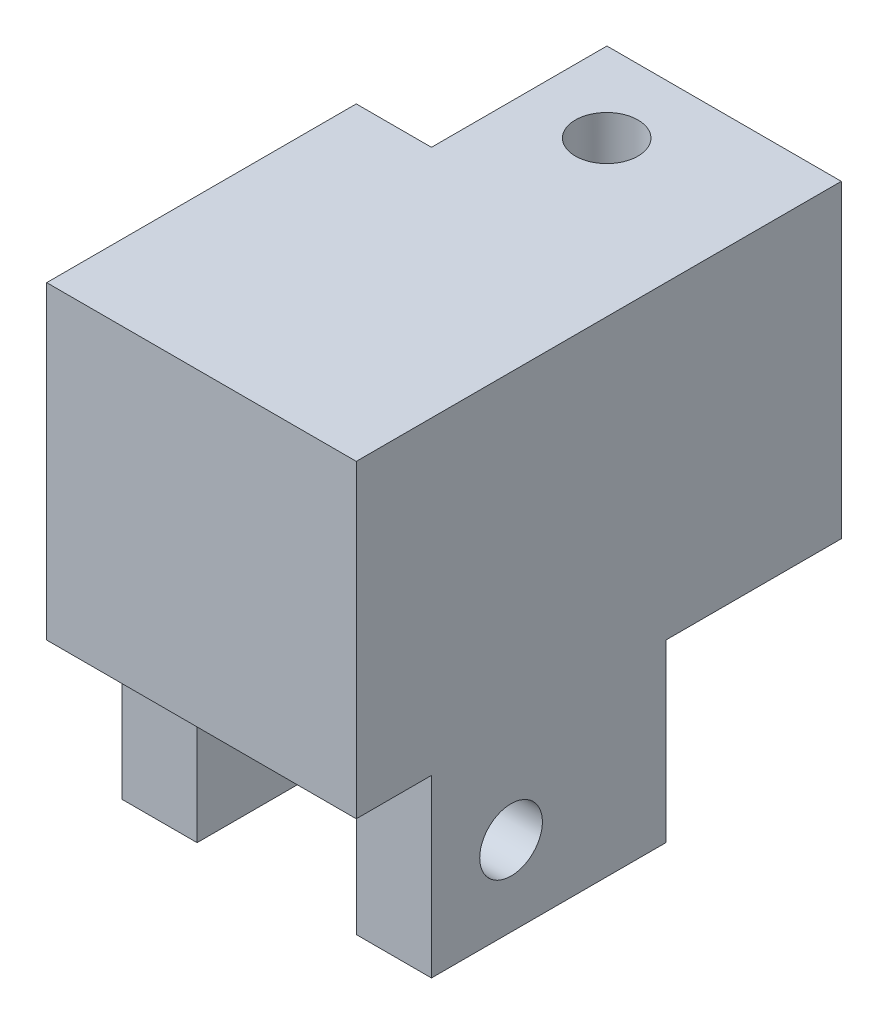
ISO-10303-21;
HEADER;
FILE_DESCRIPTION(('STEP AP214'),'2;1');
FILE_NAME('part.step','',(''),(''),'','','');
FILE_SCHEMA(('AUTOMOTIVE_DESIGN { 1 0 10303 214 1 1 1 1 }'));
ENDSEC;
DATA;
#1=APPLICATION_CONTEXT('core data for automotive mechanical design processes');
#2=APPLICATION_PROTOCOL_DEFINITION('international standard','automotive_design',2000,#1);
#3=PRODUCT_CONTEXT('',#1,'mechanical');
#4=PRODUCT('Part','Part','',(#3));
#5=PRODUCT_RELATED_PRODUCT_CATEGORY('part','',(#4));
#6=PRODUCT_DEFINITION_FORMATION('','',#4);
#7=PRODUCT_DEFINITION_CONTEXT('part definition',#1,'design');
#8=PRODUCT_DEFINITION('design','',#6,#7);
#9=PRODUCT_DEFINITION_SHAPE('','',#8);
#10=(LENGTH_UNIT() NAMED_UNIT(*) SI_UNIT(.MILLI.,.METRE.));
#11=(NAMED_UNIT(*) PLANE_ANGLE_UNIT() SI_UNIT($,.RADIAN.));
#12=(NAMED_UNIT(*) SI_UNIT($,.STERADIAN.) SOLID_ANGLE_UNIT());
#13=UNCERTAINTY_MEASURE_WITH_UNIT(LENGTH_MEASURE(1.E-05),#10,'distance_accuracy_value','');
#14=(GEOMETRIC_REPRESENTATION_CONTEXT(3) GLOBAL_UNCERTAINTY_ASSIGNED_CONTEXT((#13)) GLOBAL_UNIT_ASSIGNED_CONTEXT((#10,
#11,#12)) REPRESENTATION_CONTEXT('',''));
#15=CARTESIAN_POINT('',(0.,0.,0.));
#16=DIRECTION('',(0.,0.,1.));
#17=DIRECTION('',(1.,0.,0.));
#18=AXIS2_PLACEMENT_3D('',#15,#16,#17);
#19=CARTESIAN_POINT('',(0.,24.7,-12.35));
#20=DIRECTION('',(0.,0.,1.));
#21=DIRECTION('',(1.,0.,0.));
#22=AXIS2_PLACEMENT_3D('',#19,#20,#21);
#23=PLANE('',#22);
#24=DIRECTION('',(-1.,0.,0.));
#25=VECTOR('',#24,1.);
#26=CARTESIAN_POINT('',(0.,0.,-12.35));
#27=LINE('',#26,#25);
#28=CARTESIAN_POINT('',(12.35,0.,-12.35));
#29=VERTEX_POINT('',#28);
#30=CARTESIAN_POINT('',(-6.35,0.,-12.35));
#31=VERTEX_POINT('',#30);
#32=EDGE_CURVE('E186',#29,#31,#27,.T.);
#33=ORIENTED_EDGE('',*,*,#32,.F.);
#34=DIRECTION('',(0.,-1.,0.));
#35=VECTOR('',#34,1.);
#36=CARTESIAN_POINT('',(12.35,24.7,-12.35));
#37=LINE('',#36,#35);
#38=CARTESIAN_POINT('',(12.35,-14.,-12.35));
#39=VERTEX_POINT('',#38);
#40=EDGE_CURVE('E293',#29,#39,#37,.T.);
#41=ORIENTED_EDGE('',*,*,#40,.T.);
#42=DIRECTION('',(1.,0.,0.));
#43=VECTOR('',#42,1.);
#44=CARTESIAN_POINT('',(0.,-14.,-12.35));
#45=LINE('',#44,#43);
#46=CARTESIAN_POINT('',(-12.35,-14.,-12.35));
#47=VERTEX_POINT('',#46);
#48=EDGE_CURVE('E225',#47,#39,#45,.T.);
#49=ORIENTED_EDGE('',*,*,#48,.F.);
#50=DIRECTION('',(0.,-1.,0.));
#51=VECTOR('',#50,1.);
#52=CARTESIAN_POINT('',(-12.35,24.7,-12.35));
#53=LINE('',#52,#51);
#54=CARTESIAN_POINT('',(-12.35,24.7,-12.35));
#55=VERTEX_POINT('',#54);
#56=EDGE_CURVE('E281',#55,#47,#53,.T.);
#57=ORIENTED_EDGE('',*,*,#56,.F.);
#58=DIRECTION('',(-1.,0.,0.));
#59=VECTOR('',#58,1.);
#60=CARTESIAN_POINT('',(0.,24.7,-12.35));
#61=LINE('',#60,#59);
#62=CARTESIAN_POINT('',(-6.35,24.7,-12.35));
#63=VERTEX_POINT('',#62);
#64=EDGE_CURVE('E278',#63,#55,#61,.T.);
#65=ORIENTED_EDGE('',*,*,#64,.F.);
#66=DIRECTION('',(0.,1.,0.));
#67=VECTOR('',#66,1.);
#68=CARTESIAN_POINT('',(-6.35,0.,-12.35));
#69=LINE('',#68,#67);
#70=CARTESIAN_POINT('',(-6.35,18.7,-12.35));
#71=VERTEX_POINT('',#70);
#72=EDGE_CURVE('E58',#71,#63,#69,.T.);
#73=ORIENTED_EDGE('',*,*,#72,.F.);
#74=DIRECTION('',(-1.,0.,0.));
#75=VECTOR('',#74,1.);
#76=CARTESIAN_POINT('',(0.,18.7,-12.35));
#77=LINE('',#76,#75);
#78=CARTESIAN_POINT('',(6.35,18.7,-12.35));
#79=VERTEX_POINT('',#78);
#80=EDGE_CURVE('E62',#79,#71,#77,.T.);
#81=ORIENTED_EDGE('',*,*,#80,.F.);
#82=DIRECTION('',(0.,1.,0.));
#83=VECTOR('',#82,1.);
#84=CARTESIAN_POINT('',(6.35,0.,-12.35));
#85=LINE('',#84,#83);
#86=CARTESIAN_POINT('',(6.35,6.,-12.35));
#87=VERTEX_POINT('',#86);
#88=EDGE_CURVE('E345',#87,#79,#85,.T.);
#89=ORIENTED_EDGE('',*,*,#88,.F.);
#90=DIRECTION('',(-1.,0.,0.));
#91=VECTOR('',#90,1.);
#92=CARTESIAN_POINT('',(0.,6.,-12.35));
#93=LINE('',#92,#91);
#94=CARTESIAN_POINT('',(-6.35,6.,-12.35));
#95=VERTEX_POINT('',#94);
#96=EDGE_CURVE('E342',#87,#95,#93,.T.);
#97=ORIENTED_EDGE('',*,*,#96,.T.);
#98=DIRECTION('',(0.,1.,0.));
#99=VECTOR('',#98,1.);
#100=CARTESIAN_POINT('',(-6.35,0.,-12.35));
#101=LINE('',#100,#99);
#102=EDGE_CURVE('E339',#31,#95,#101,.T.);
#103=ORIENTED_EDGE('',*,*,#102,.F.);
#104=EDGE_LOOP('',(#33,#41,#49,#57,#65,#73,#81,#89,#97,#103));
#105=FACE_BOUND('',#104,.T.);
#106=ADVANCED_FACE('F40',(#105),#23,.F.);
#107=CARTESIAN_POINT('',(0.,0.,0.));
#108=DIRECTION('',(0.,1.,0.));
#109=DIRECTION('',(0.,0.,1.));
#110=AXIS2_PLACEMENT_3D('',#107,#108,#109);
#111=PLANE('',#110);
#112=DIRECTION('',(-1.,0.,0.));
#113=VECTOR('',#112,1.);
#114=CARTESIAN_POINT('',(0.,0.,6.35));
#115=LINE('',#114,#113);
#116=CARTESIAN_POINT('',(-6.35,0.,6.35));
#117=VERTEX_POINT('',#116);
#118=CARTESIAN_POINT('',(-12.35,0.,6.35));
#119=VERTEX_POINT('',#118);
#120=EDGE_CURVE('E204',#117,#119,#115,.T.);
#121=ORIENTED_EDGE('',*,*,#120,.F.);
#122=DIRECTION('',(0.,0.,1.));
#123=VECTOR('',#122,1.);
#124=CARTESIAN_POINT('',(-6.35,0.,0.));
#125=LINE('',#124,#123);
#126=CARTESIAN_POINT('',(-6.35,0.,-6.35));
#127=VERTEX_POINT('',#126);
#128=EDGE_CURVE('E235',#127,#117,#125,.T.);
#129=ORIENTED_EDGE('',*,*,#128,.F.);
#130=DIRECTION('',(1.,0.,0.));
#131=VECTOR('',#130,1.);
#132=CARTESIAN_POINT('',(0.,0.,-6.35));
#133=LINE('',#132,#131);
#134=CARTESIAN_POINT('',(6.35,0.,-6.35));
#135=VERTEX_POINT('',#134);
#136=EDGE_CURVE('E232',#127,#135,#133,.T.);
#137=ORIENTED_EDGE('',*,*,#136,.T.);
#138=DIRECTION('',(0.,0.,1.));
#139=VECTOR('',#138,1.);
#140=CARTESIAN_POINT('',(6.35,0.,0.));
#141=LINE('',#140,#139);
#142=CARTESIAN_POINT('',(6.35,0.,6.35));
#143=VERTEX_POINT('',#142);
#144=EDGE_CURVE('E193',#135,#143,#141,.T.);
#145=ORIENTED_EDGE('',*,*,#144,.T.);
#146=DIRECTION('',(-1.,0.,0.));
#147=VECTOR('',#146,1.);
#148=CARTESIAN_POINT('',(0.,0.,6.35));
#149=LINE('',#148,#147);
#150=CARTESIAN_POINT('',(12.35,0.,6.35));
#151=VERTEX_POINT('',#150);
#152=EDGE_CURVE('E188',#151,#143,#149,.T.);
#153=ORIENTED_EDGE('',*,*,#152,.F.);
#154=DIRECTION('',(0.,0.,-1.));
#155=VECTOR('',#154,1.);
#156=CARTESIAN_POINT('',(12.35,0.,0.));
#157=LINE('',#156,#155);
#158=CARTESIAN_POINT('',(12.35,0.,12.35));
#159=VERTEX_POINT('',#158);
#160=EDGE_CURVE('E271',#159,#151,#157,.T.);
#161=ORIENTED_EDGE('',*,*,#160,.F.);
#162=DIRECTION('',(-1.,0.,0.));
#163=VECTOR('',#162,1.);
#164=CARTESIAN_POINT('',(0.,0.,12.35));
#165=LINE('',#164,#163);
#166=CARTESIAN_POINT('',(-12.35,0.,12.35));
#167=VERTEX_POINT('',#166);
#168=EDGE_CURVE('E284',#159,#167,#165,.T.);
#169=ORIENTED_EDGE('',*,*,#168,.T.);
#170=DIRECTION('',(0.,0.,-1.));
#171=VECTOR('',#170,1.);
#172=CARTESIAN_POINT('',(-12.35,0.,0.));
#173=LINE('',#172,#171);
#174=EDGE_CURVE('E265',#167,#119,#173,.T.);
#175=ORIENTED_EDGE('',*,*,#174,.T.);
#176=EDGE_LOOP('',(#121,#129,#137,#145,#153,#161,#169,#175));
#177=FACE_BOUND('',#176,.T.);
#178=ADVANCED_FACE('F417',(#177),#111,.F.);
#179=CARTESIAN_POINT('',(-12.35,24.7,0.));
#180=DIRECTION('',(-1.,0.,0.));
#181=DIRECTION('',(0.,0.,1.));
#182=AXIS2_PLACEMENT_3D('',#179,#180,#181);
#183=PLANE('',#182);
#184=CARTESIAN_POINT('',(-12.35,-7.63,0.));
#185=DIRECTION('',(-1.,0.,0.));
#186=DIRECTION('',(0.,0.,1.));
#187=AXIS2_PLACEMENT_3D('',#184,#185,#186);
#188=CIRCLE('',#187,2.5);
#189=CARTESIAN_POINT('',(-12.35,-7.63,2.5));
#190=VERTEX_POINT('',#189);
#191=EDGE_CURVE('E439',#190,#190,#188,.T.);
#192=ORIENTED_EDGE('',*,*,#191,.F.);
#193=EDGE_LOOP('',(#192));
#194=FACE_BOUND('',#193,.T.);
#195=ORIENTED_EDGE('',*,*,#174,.F.);
#196=DIRECTION('',(0.,-1.,0.));
#197=VECTOR('',#196,1.);
#198=CARTESIAN_POINT('',(-12.35,24.7,12.35));
#199=LINE('',#198,#197);
#200=CARTESIAN_POINT('',(-12.35,24.7,12.35));
#201=VERTEX_POINT('',#200);
#202=EDGE_CURVE('E11',#201,#167,#199,.T.);
#203=ORIENTED_EDGE('',*,*,#202,.F.);
#204=DIRECTION('',(0.,0.,-1.));
#205=VECTOR('',#204,1.);
#206=CARTESIAN_POINT('',(-12.35,24.7,0.));
#207=LINE('',#206,#205);
#208=EDGE_CURVE('E266',#201,#55,#207,.T.);
#209=ORIENTED_EDGE('',*,*,#208,.T.);
#210=ORIENTED_EDGE('',*,*,#56,.T.);
#211=DIRECTION('',(0.,0.,-1.));
#212=VECTOR('',#211,1.);
#213=CARTESIAN_POINT('',(-12.35,-14.,0.));
#214=LINE('',#213,#212);
#215=CARTESIAN_POINT('',(-12.35,-14.,6.35));
#216=VERTEX_POINT('',#215);
#217=EDGE_CURVE('E221',#216,#47,#214,.T.);
#218=ORIENTED_EDGE('',*,*,#217,.F.);
#219=DIRECTION('',(0.,1.,0.));
#220=VECTOR('',#219,1.);
#221=CARTESIAN_POINT('',(-12.35,-14.,6.35));
#222=LINE('',#221,#220);
#223=EDGE_CURVE('E228',#216,#119,#222,.T.);
#224=ORIENTED_EDGE('',*,*,#223,.T.);
#225=EDGE_LOOP('',(#195,#203,#209,#210,#218,#224));
#226=FACE_BOUND('',#225,.T.);
#227=ADVANCED_FACE('F42',(#194,#226),#183,.T.);
#228=CARTESIAN_POINT('',(0.,24.7,12.35));
#229=DIRECTION('',(0.,0.,1.));
#230=DIRECTION('',(1.,0.,0.));
#231=AXIS2_PLACEMENT_3D('',#228,#229,#230);
#232=PLANE('',#231);
#233=ORIENTED_EDGE('',*,*,#168,.F.);
#234=DIRECTION('',(0.,-1.,0.));
#235=VECTOR('',#234,1.);
#236=CARTESIAN_POINT('',(12.35,24.7,12.35));
#237=LINE('',#236,#235);
#238=CARTESIAN_POINT('',(12.35,24.7,12.35));
#239=VERTEX_POINT('',#238);
#240=EDGE_CURVE('E50',#239,#159,#237,.T.);
#241=ORIENTED_EDGE('',*,*,#240,.F.);
#242=DIRECTION('',(-1.,0.,0.));
#243=VECTOR('',#242,1.);
#244=CARTESIAN_POINT('',(0.,24.7,12.35));
#245=LINE('',#244,#243);
#246=EDGE_CURVE('E270',#239,#201,#245,.T.);
#247=ORIENTED_EDGE('',*,*,#246,.T.);
#248=ORIENTED_EDGE('',*,*,#202,.T.);
#249=EDGE_LOOP('',(#233,#241,#247,#248));
#250=FACE_BOUND('',#249,.T.);
#251=ADVANCED_FACE('F394',(#250),#232,.T.);
#252=CARTESIAN_POINT('',(12.35,24.7,0.));
#253=DIRECTION('',(-1.,0.,0.));
#254=DIRECTION('',(0.,0.,1.));
#255=AXIS2_PLACEMENT_3D('',#252,#253,#254);
#256=PLANE('',#255);
#257=CARTESIAN_POINT('',(12.35,-7.63,0.));
#258=DIRECTION('',(-1.,0.,0.));
#259=DIRECTION('',(0.,0.,1.));
#260=AXIS2_PLACEMENT_3D('',#257,#258,#259);
#261=CIRCLE('',#260,2.5);
#262=CARTESIAN_POINT('',(12.35,-7.63,2.5));
#263=VERTEX_POINT('',#262);
#264=EDGE_CURVE('E442',#263,#263,#261,.T.);
#265=ORIENTED_EDGE('',*,*,#264,.T.);
#266=EDGE_LOOP('',(#265));
#267=FACE_BOUND('',#266,.T.);
#268=ORIENTED_EDGE('',*,*,#160,.T.);
#269=DIRECTION('',(0.,1.,0.));
#270=VECTOR('',#269,1.);
#271=CARTESIAN_POINT('',(12.35,-14.,6.35));
#272=LINE('',#271,#270);
#273=CARTESIAN_POINT('',(12.35,-14.,6.35));
#274=VERTEX_POINT('',#273);
#275=EDGE_CURVE('E261',#274,#151,#272,.T.);
#276=ORIENTED_EDGE('',*,*,#275,.F.);
#277=DIRECTION('',(0.,0.,1.));
#278=VECTOR('',#277,1.);
#279=CARTESIAN_POINT('',(12.35,-14.,0.));
#280=LINE('',#279,#278);
#281=EDGE_CURVE('E199',#39,#274,#280,.T.);
#282=ORIENTED_EDGE('',*,*,#281,.F.);
#283=ORIENTED_EDGE('',*,*,#40,.F.);
#284=DIRECTION('',(0.,0.,1.));
#285=VECTOR('',#284,1.);
#286=CARTESIAN_POINT('',(12.35,0.,-26.35));
#287=LINE('',#286,#285);
#288=CARTESIAN_POINT('',(12.35,0.,-26.35));
#289=VERTEX_POINT('',#288);
#290=EDGE_CURVE('E336',#289,#29,#287,.T.);
#291=ORIENTED_EDGE('',*,*,#290,.F.);
#292=DIRECTION('',(0.,-1.,0.));
#293=VECTOR('',#292,1.);
#294=CARTESIAN_POINT('',(12.35,0.,-26.35));
#295=LINE('',#294,#293);
#296=CARTESIAN_POINT('',(12.35,24.7,-26.35));
#297=VERTEX_POINT('',#296);
#298=EDGE_CURVE('E179',#297,#289,#295,.T.);
#299=ORIENTED_EDGE('',*,*,#298,.F.);
#300=DIRECTION('',(0.,0.,-1.));
#301=VECTOR('',#300,1.);
#302=CARTESIAN_POINT('',(12.35,24.7,0.));
#303=LINE('',#302,#301);
#304=EDGE_CURVE('E275',#239,#297,#303,.T.);
#305=ORIENTED_EDGE('',*,*,#304,.F.);
#306=ORIENTED_EDGE('',*,*,#240,.T.);
#307=EDGE_LOOP('',(#268,#276,#282,#283,#291,#299,#305,#306));
#308=FACE_BOUND('',#307,.T.);
#309=ADVANCED_FACE('F378',(#267,#308),#256,.F.);
#310=CARTESIAN_POINT('',(0.,24.7,0.));
#311=DIRECTION('',(0.,1.,0.));
#312=DIRECTION('',(0.,0.,1.));
#313=AXIS2_PLACEMENT_3D('',#310,#311,#312);
#314=PLANE('',#313);
#315=CARTESIAN_POINT('',(0.,24.7,-19.98));
#316=DIRECTION('',(0.,-1.,0.));
#317=DIRECTION('',(0.,0.,-1.));
#318=AXIS2_PLACEMENT_3D('',#315,#316,#317);
#319=CIRCLE('',#318,2.5);
#320=CARTESIAN_POINT('',(0.,24.7,-22.48));
#321=VERTEX_POINT('',#320);
#322=EDGE_CURVE('E301',#321,#321,#319,.T.);
#323=ORIENTED_EDGE('',*,*,#322,.T.);
#324=EDGE_LOOP('',(#323));
#325=FACE_BOUND('',#324,.T.);
#326=ORIENTED_EDGE('',*,*,#208,.F.);
#327=ORIENTED_EDGE('',*,*,#246,.F.);
#328=ORIENTED_EDGE('',*,*,#304,.T.);
#329=DIRECTION('',(1.,0.,0.));
#330=VECTOR('',#329,1.);
#331=CARTESIAN_POINT('',(0.,24.7,-26.35));
#332=LINE('',#331,#330);
#333=CARTESIAN_POINT('',(-6.35,24.7,-26.35));
#334=VERTEX_POINT('',#333);
#335=EDGE_CURVE('E331',#334,#297,#332,.T.);
#336=ORIENTED_EDGE('',*,*,#335,.F.);
#337=DIRECTION('',(0.,0.,1.));
#338=VECTOR('',#337,1.);
#339=CARTESIAN_POINT('',(-6.35,24.7,-26.35));
#340=LINE('',#339,#338);
#341=EDGE_CURVE('E354',#334,#63,#340,.T.);
#342=ORIENTED_EDGE('',*,*,#341,.T.);
#343=ORIENTED_EDGE('',*,*,#64,.T.);
#344=EDGE_LOOP('',(#326,#327,#328,#336,#342,#343));
#345=FACE_BOUND('',#344,.T.);
#346=ADVANCED_FACE('F391',(#325,#345),#314,.T.);
#347=CARTESIAN_POINT('',(0.,-14.,6.35));
#348=DIRECTION('',(0.,0.,-1.));
#349=DIRECTION('',(-1.,0.,0.));
#350=AXIS2_PLACEMENT_3D('',#347,#348,#349);
#351=PLANE('',#350);
#352=ORIENTED_EDGE('',*,*,#152,.T.);
#353=DIRECTION('',(0.,1.,0.));
#354=VECTOR('',#353,1.);
#355=CARTESIAN_POINT('',(6.35,-14.,6.35));
#356=LINE('',#355,#354);
#357=CARTESIAN_POINT('',(6.35,-14.,6.35));
#358=VERTEX_POINT('',#357);
#359=EDGE_CURVE('E257',#358,#143,#356,.T.);
#360=ORIENTED_EDGE('',*,*,#359,.F.);
#361=DIRECTION('',(-1.,0.,0.));
#362=VECTOR('',#361,1.);
#363=CARTESIAN_POINT('',(0.,-14.,6.35));
#364=LINE('',#363,#362);
#365=EDGE_CURVE('E203',#274,#358,#364,.T.);
#366=ORIENTED_EDGE('',*,*,#365,.F.);
#367=ORIENTED_EDGE('',*,*,#275,.T.);
#368=EDGE_LOOP('',(#352,#360,#366,#367));
#369=FACE_BOUND('',#368,.T.);
#370=ADVANCED_FACE('F462',(#369),#351,.F.);
#371=CARTESIAN_POINT('',(6.35,-14.,0.));
#372=DIRECTION('',(-1.,0.,0.));
#373=DIRECTION('',(0.,0.,1.));
#374=AXIS2_PLACEMENT_3D('',#371,#372,#373);
#375=PLANE('',#374);
#376=CARTESIAN_POINT('',(6.35,-7.63,0.));
#377=DIRECTION('',(-1.,0.,0.));
#378=DIRECTION('',(0.,0.,1.));
#379=AXIS2_PLACEMENT_3D('',#376,#377,#378);
#380=CIRCLE('',#379,2.5);
#381=CARTESIAN_POINT('',(6.35,-7.63,2.5));
#382=VERTEX_POINT('',#381);
#383=EDGE_CURVE('E315',#382,#382,#380,.T.);
#384=ORIENTED_EDGE('',*,*,#383,.F.);
#385=EDGE_LOOP('',(#384));
#386=FACE_BOUND('',#385,.T.);
#387=ORIENTED_EDGE('',*,*,#144,.F.);
#388=DIRECTION('',(0.,1.,0.));
#389=VECTOR('',#388,1.);
#390=CARTESIAN_POINT('',(6.35,-14.,-6.35));
#391=LINE('',#390,#389);
#392=CARTESIAN_POINT('',(6.35,-14.,-6.35));
#393=VERTEX_POINT('',#392);
#394=EDGE_CURVE('E253',#393,#135,#391,.T.);
#395=ORIENTED_EDGE('',*,*,#394,.F.);
#396=DIRECTION('',(0.,0.,1.));
#397=VECTOR('',#396,1.);
#398=CARTESIAN_POINT('',(6.35,-14.,0.));
#399=LINE('',#398,#397);
#400=EDGE_CURVE('E207',#393,#358,#399,.T.);
#401=ORIENTED_EDGE('',*,*,#400,.T.);
#402=ORIENTED_EDGE('',*,*,#359,.T.);
#403=EDGE_LOOP('',(#387,#395,#401,#402));
#404=FACE_BOUND('',#403,.T.);
#405=ADVANCED_FACE('F458',(#386,#404),#375,.T.);
#406=CARTESIAN_POINT('',(0.,-14.,-6.35));
#407=DIRECTION('',(0.,0.,1.));
#408=DIRECTION('',(1.,0.,0.));
#409=AXIS2_PLACEMENT_3D('',#406,#407,#408);
#410=PLANE('',#409);
#411=ORIENTED_EDGE('',*,*,#136,.F.);
#412=DIRECTION('',(0.,1.,0.));
#413=VECTOR('',#412,1.);
#414=CARTESIAN_POINT('',(-6.35,-14.,-6.35));
#415=LINE('',#414,#413);
#416=CARTESIAN_POINT('',(-6.35,-14.,-6.35));
#417=VERTEX_POINT('',#416);
#418=EDGE_CURVE('E249',#417,#127,#415,.T.);
#419=ORIENTED_EDGE('',*,*,#418,.F.);
#420=DIRECTION('',(1.,0.,0.));
#421=VECTOR('',#420,1.);
#422=CARTESIAN_POINT('',(0.,-14.,-6.35));
#423=LINE('',#422,#421);
#424=EDGE_CURVE('E211',#417,#393,#423,.T.);
#425=ORIENTED_EDGE('',*,*,#424,.T.);
#426=ORIENTED_EDGE('',*,*,#394,.T.);
#427=EDGE_LOOP('',(#411,#419,#425,#426));
#428=FACE_BOUND('',#427,.T.);
#429=ADVANCED_FACE('F461',(#428),#410,.T.);
#430=CARTESIAN_POINT('',(-6.35,-14.,0.));
#431=DIRECTION('',(-1.,0.,0.));
#432=DIRECTION('',(0.,0.,1.));
#433=AXIS2_PLACEMENT_3D('',#430,#431,#432);
#434=PLANE('',#433);
#435=CARTESIAN_POINT('',(-6.35,-7.63,0.));
#436=DIRECTION('',(-1.,0.,0.));
#437=DIRECTION('',(0.,0.,1.));
#438=AXIS2_PLACEMENT_3D('',#435,#436,#437);
#439=CIRCLE('',#438,2.5);
#440=CARTESIAN_POINT('',(-6.35,-7.63,2.5));
#441=VERTEX_POINT('',#440);
#442=EDGE_CURVE('E44',#441,#441,#439,.T.);
#443=ORIENTED_EDGE('',*,*,#442,.T.);
#444=EDGE_LOOP('',(#443));
#445=FACE_BOUND('',#444,.T.);
#446=ORIENTED_EDGE('',*,*,#128,.T.);
#447=DIRECTION('',(0.,1.,0.));
#448=VECTOR('',#447,1.);
#449=CARTESIAN_POINT('',(-6.35,-14.,6.35));
#450=LINE('',#449,#448);
#451=CARTESIAN_POINT('',(-6.35,-14.,6.35));
#452=VERTEX_POINT('',#451);
#453=EDGE_CURVE('E245',#452,#117,#450,.T.);
#454=ORIENTED_EDGE('',*,*,#453,.F.);
#455=DIRECTION('',(0.,0.,1.));
#456=VECTOR('',#455,1.);
#457=CARTESIAN_POINT('',(-6.35,-14.,0.));
#458=LINE('',#457,#456);
#459=EDGE_CURVE('E215',#417,#452,#458,.T.);
#460=ORIENTED_EDGE('',*,*,#459,.F.);
#461=ORIENTED_EDGE('',*,*,#418,.T.);
#462=EDGE_LOOP('',(#446,#454,#460,#461));
#463=FACE_BOUND('',#462,.T.);
#464=ADVANCED_FACE('F473',(#445,#463),#434,.F.);
#465=CARTESIAN_POINT('',(0.,-14.,6.35));
#466=DIRECTION('',(0.,0.,-1.));
#467=DIRECTION('',(-1.,0.,0.));
#468=AXIS2_PLACEMENT_3D('',#465,#466,#467);
#469=PLANE('',#468);
#470=ORIENTED_EDGE('',*,*,#120,.T.);
#471=ORIENTED_EDGE('',*,*,#223,.F.);
#472=DIRECTION('',(-1.,0.,0.));
#473=VECTOR('',#472,1.);
#474=CARTESIAN_POINT('',(0.,-14.,6.35));
#475=LINE('',#474,#473);
#476=EDGE_CURVE('E218',#452,#216,#475,.T.);
#477=ORIENTED_EDGE('',*,*,#476,.F.);
#478=ORIENTED_EDGE('',*,*,#453,.T.);
#479=EDGE_LOOP('',(#470,#471,#477,#478));
#480=FACE_BOUND('',#479,.T.);
#481=ADVANCED_FACE('F475',(#480),#469,.F.);
#482=CARTESIAN_POINT('',(0.,-14.,0.));
#483=DIRECTION('',(0.,-1.,0.));
#484=DIRECTION('',(0.,0.,-1.));
#485=AXIS2_PLACEMENT_3D('',#482,#483,#484);
#486=PLANE('',#485);
#487=ORIENTED_EDGE('',*,*,#281,.T.);
#488=ORIENTED_EDGE('',*,*,#365,.T.);
#489=ORIENTED_EDGE('',*,*,#400,.F.);
#490=ORIENTED_EDGE('',*,*,#424,.F.);
#491=ORIENTED_EDGE('',*,*,#459,.T.);
#492=ORIENTED_EDGE('',*,*,#476,.T.);
#493=ORIENTED_EDGE('',*,*,#217,.T.);
#494=ORIENTED_EDGE('',*,*,#48,.T.);
#495=EDGE_LOOP('',(#487,#488,#489,#490,#491,#492,#493,#494));
#496=FACE_BOUND('',#495,.T.);
#497=ADVANCED_FACE('F381',(#496),#486,.T.);
#498=CARTESIAN_POINT('',(0.,0.,-26.35));
#499=DIRECTION('',(0.,1.,0.));
#500=DIRECTION('',(0.,0.,1.));
#501=AXIS2_PLACEMENT_3D('',#498,#499,#500);
#502=PLANE('',#501);
#503=CARTESIAN_POINT('',(0.,0.,-19.98));
#504=DIRECTION('',(0.,-1.,0.));
#505=DIRECTION('',(0.,0.,-1.));
#506=AXIS2_PLACEMENT_3D('',#503,#504,#505);
#507=CIRCLE('',#506,2.5);
#508=CARTESIAN_POINT('',(0.,0.,-22.48));
#509=VERTEX_POINT('',#508);
#510=EDGE_CURVE('E309',#509,#509,#507,.T.);
#511=ORIENTED_EDGE('',*,*,#510,.F.);
#512=EDGE_LOOP('',(#511));
#513=FACE_BOUND('',#512,.T.);
#514=ORIENTED_EDGE('',*,*,#32,.T.);
#515=DIRECTION('',(0.,0.,1.));
#516=VECTOR('',#515,1.);
#517=CARTESIAN_POINT('',(-6.35,0.,-26.35));
#518=LINE('',#517,#516);
#519=CARTESIAN_POINT('',(-6.35,0.,-26.35));
#520=VERTEX_POINT('',#519);
#521=EDGE_CURVE('E164',#520,#31,#518,.T.);
#522=ORIENTED_EDGE('',*,*,#521,.F.);
#523=DIRECTION('',(-1.,0.,0.));
#524=VECTOR('',#523,1.);
#525=CARTESIAN_POINT('',(0.,0.,-26.35));
#526=LINE('',#525,#524);
#527=EDGE_CURVE('E173',#289,#520,#526,.T.);
#528=ORIENTED_EDGE('',*,*,#527,.F.);
#529=ORIENTED_EDGE('',*,*,#290,.T.);
#530=EDGE_LOOP('',(#514,#522,#528,#529));
#531=FACE_BOUND('',#530,.T.);
#532=ADVANCED_FACE('F185',(#513,#531),#502,.F.);
#533=CARTESIAN_POINT('',(-6.35,0.,-26.35));
#534=DIRECTION('',(1.,0.,0.));
#535=DIRECTION('',(0.,1.,0.));
#536=AXIS2_PLACEMENT_3D('',#533,#534,#535);
#537=PLANE('',#536);
#538=ORIENTED_EDGE('',*,*,#102,.T.);
#539=DIRECTION('',(0.,0.,1.));
#540=VECTOR('',#539,1.);
#541=CARTESIAN_POINT('',(-6.35,6.,-26.35));
#542=LINE('',#541,#540);
#543=CARTESIAN_POINT('',(-6.35,6.,-26.35));
#544=VERTEX_POINT('',#543);
#545=EDGE_CURVE('E167',#544,#95,#542,.T.);
#546=ORIENTED_EDGE('',*,*,#545,.F.);
#547=DIRECTION('',(0.,1.,0.));
#548=VECTOR('',#547,1.);
#549=CARTESIAN_POINT('',(-6.35,0.,-26.35));
#550=LINE('',#549,#548);
#551=EDGE_CURVE('E159',#520,#544,#550,.T.);
#552=ORIENTED_EDGE('',*,*,#551,.F.);
#553=ORIENTED_EDGE('',*,*,#521,.T.);
#554=EDGE_LOOP('',(#538,#546,#552,#553));
#555=FACE_BOUND('',#554,.T.);
#556=ADVANCED_FACE('F162',(#555),#537,.F.);
#557=CARTESIAN_POINT('',(0.,6.,-26.35));
#558=DIRECTION('',(0.,1.,0.));
#559=DIRECTION('',(0.,0.,1.));
#560=AXIS2_PLACEMENT_3D('',#557,#558,#559);
#561=PLANE('',#560);
#562=CARTESIAN_POINT('',(0.,6.,-19.98));
#563=DIRECTION('',(0.,1.,0.));
#564=DIRECTION('',(0.,0.,1.));
#565=AXIS2_PLACEMENT_3D('',#562,#563,#564);
#566=CIRCLE('',#565,2.5);
#567=CARTESIAN_POINT('',(0.,6.,-17.48));
#568=VERTEX_POINT('',#567);
#569=EDGE_CURVE('E300',#568,#568,#566,.T.);
#570=ORIENTED_EDGE('',*,*,#569,.F.);
#571=EDGE_LOOP('',(#570));
#572=FACE_BOUND('',#571,.T.);
#573=ORIENTED_EDGE('',*,*,#96,.F.);
#574=DIRECTION('',(0.,0.,1.));
#575=VECTOR('',#574,1.);
#576=CARTESIAN_POINT('',(6.35,6.,-26.35));
#577=LINE('',#576,#575);
#578=CARTESIAN_POINT('',(6.35,6.,-26.35));
#579=VERTEX_POINT('',#578);
#580=EDGE_CURVE('E195',#579,#87,#577,.T.);
#581=ORIENTED_EDGE('',*,*,#580,.F.);
#582=DIRECTION('',(-1.,0.,0.));
#583=VECTOR('',#582,1.);
#584=CARTESIAN_POINT('',(0.,6.,-26.35));
#585=LINE('',#584,#583);
#586=EDGE_CURVE('E172',#579,#544,#585,.T.);
#587=ORIENTED_EDGE('',*,*,#586,.T.);
#588=ORIENTED_EDGE('',*,*,#545,.T.);
#589=EDGE_LOOP('',(#573,#581,#587,#588));
#590=FACE_BOUND('',#589,.T.);
#591=ADVANCED_FACE('F373',(#572,#590),#561,.T.);
#592=CARTESIAN_POINT('',(6.35,0.,-26.35));
#593=DIRECTION('',(1.,0.,0.));
#594=DIRECTION('',(0.,0.,-1.));
#595=AXIS2_PLACEMENT_3D('',#592,#593,#594);
#596=PLANE('',#595);
#597=ORIENTED_EDGE('',*,*,#88,.T.);
#598=DIRECTION('',(0.,0.,1.));
#599=VECTOR('',#598,1.);
#600=CARTESIAN_POINT('',(6.35,18.7,-26.35));
#601=LINE('',#600,#599);
#602=CARTESIAN_POINT('',(6.35,18.7,-26.35));
#603=VERTEX_POINT('',#602);
#604=EDGE_CURVE('E362',#603,#79,#601,.T.);
#605=ORIENTED_EDGE('',*,*,#604,.F.);
#606=DIRECTION('',(0.,1.,0.));
#607=VECTOR('',#606,1.);
#608=CARTESIAN_POINT('',(6.35,0.,-26.35));
#609=LINE('',#608,#607);
#610=EDGE_CURVE('E322',#579,#603,#609,.T.);
#611=ORIENTED_EDGE('',*,*,#610,.F.);
#612=ORIENTED_EDGE('',*,*,#580,.T.);
#613=EDGE_LOOP('',(#597,#605,#611,#612));
#614=FACE_BOUND('',#613,.T.);
#615=ADVANCED_FACE('F370',(#614),#596,.F.);
#616=CARTESIAN_POINT('',(0.,18.7,-26.35));
#617=DIRECTION('',(0.,1.,0.));
#618=DIRECTION('',(0.,0.,1.));
#619=AXIS2_PLACEMENT_3D('',#616,#617,#618);
#620=PLANE('',#619);
#621=CARTESIAN_POINT('',(0.,18.7,-19.98));
#622=DIRECTION('',(0.,1.,0.));
#623=DIRECTION('',(0.,0.,1.));
#624=AXIS2_PLACEMENT_3D('',#621,#622,#623);
#625=CIRCLE('',#624,2.5);
#626=CARTESIAN_POINT('',(0.,18.7,-17.48));
#627=VERTEX_POINT('',#626);
#628=EDGE_CURVE('E297',#627,#627,#625,.T.);
#629=ORIENTED_EDGE('',*,*,#628,.T.);
#630=EDGE_LOOP('',(#629));
#631=FACE_BOUND('',#630,.T.);
#632=ORIENTED_EDGE('',*,*,#80,.T.);
#633=DIRECTION('',(0.,0.,1.));
#634=VECTOR('',#633,1.);
#635=CARTESIAN_POINT('',(-6.35,18.7,-26.35));
#636=LINE('',#635,#634);
#637=CARTESIAN_POINT('',(-6.35,18.7,-26.35));
#638=VERTEX_POINT('',#637);
#639=EDGE_CURVE('E358',#638,#71,#636,.T.);
#640=ORIENTED_EDGE('',*,*,#639,.F.);
#641=DIRECTION('',(-1.,0.,0.));
#642=VECTOR('',#641,1.);
#643=CARTESIAN_POINT('',(0.,18.7,-26.35));
#644=LINE('',#643,#642);
#645=EDGE_CURVE('E325',#603,#638,#644,.T.);
#646=ORIENTED_EDGE('',*,*,#645,.F.);
#647=ORIENTED_EDGE('',*,*,#604,.T.);
#648=EDGE_LOOP('',(#632,#640,#646,#647));
#649=FACE_BOUND('',#648,.T.);
#650=ADVANCED_FACE('F405',(#631,#649),#620,.F.);
#651=CARTESIAN_POINT('',(-6.35,0.,-26.35));
#652=DIRECTION('',(1.,0.,0.));
#653=DIRECTION('',(0.,1.,0.));
#654=AXIS2_PLACEMENT_3D('',#651,#652,#653);
#655=PLANE('',#654);
#656=ORIENTED_EDGE('',*,*,#72,.T.);
#657=ORIENTED_EDGE('',*,*,#341,.F.);
#658=DIRECTION('',(0.,1.,0.));
#659=VECTOR('',#658,1.);
#660=CARTESIAN_POINT('',(-6.35,0.,-26.35));
#661=LINE('',#660,#659);
#662=EDGE_CURVE('E328',#638,#334,#661,.T.);
#663=ORIENTED_EDGE('',*,*,#662,.F.);
#664=ORIENTED_EDGE('',*,*,#639,.T.);
#665=EDGE_LOOP('',(#656,#657,#663,#664));
#666=FACE_BOUND('',#665,.T.);
#667=ADVANCED_FACE('F403',(#666),#655,.F.);
#668=CARTESIAN_POINT('',(0.,0.,-26.35));
#669=DIRECTION('',(0.,0.,-1.));
#670=DIRECTION('',(-1.,0.,0.));
#671=AXIS2_PLACEMENT_3D('',#668,#669,#670);
#672=PLANE('',#671);
#673=ORIENTED_EDGE('',*,*,#527,.T.);
#674=ORIENTED_EDGE('',*,*,#551,.T.);
#675=ORIENTED_EDGE('',*,*,#586,.F.);
#676=ORIENTED_EDGE('',*,*,#610,.T.);
#677=ORIENTED_EDGE('',*,*,#645,.T.);
#678=ORIENTED_EDGE('',*,*,#662,.T.);
#679=ORIENTED_EDGE('',*,*,#335,.T.);
#680=ORIENTED_EDGE('',*,*,#298,.T.);
#681=EDGE_LOOP('',(#673,#674,#675,#676,#677,#678,#679,#680));
#682=FACE_BOUND('',#681,.T.);
#683=ADVANCED_FACE('F176',(#682),#672,.T.);
#684=CARTESIAN_POINT('',(0.,24.7,-19.98));
#685=DIRECTION('',(0.,-1.,0.));
#686=DIRECTION('',(0.,0.,-1.));
#687=AXIS2_PLACEMENT_3D('',#684,#685,#686);
#688=CYLINDRICAL_SURFACE('',#687,2.5);
#689=ORIENTED_EDGE('',*,*,#322,.F.);
#690=EDGE_LOOP('',(#689));
#691=FACE_BOUND('',#690,.T.);
#692=ORIENTED_EDGE('',*,*,#628,.F.);
#693=EDGE_LOOP('',(#692));
#694=FACE_BOUND('',#693,.T.);
#695=ADVANCED_FACE('F507',(#691,#694),#688,.F.);
#696=ORIENTED_EDGE('',*,*,#569,.T.);
#697=EDGE_LOOP('',(#696));
#698=FACE_BOUND('',#697,.T.);
#699=ORIENTED_EDGE('',*,*,#510,.T.);
#700=EDGE_LOOP('',(#699));
#701=FACE_BOUND('',#700,.T.);
#702=ADVANCED_FACE('F503',(#698,#701),#688,.F.);
#703=CARTESIAN_POINT('',(12.35,-7.63,0.));
#704=DIRECTION('',(-1.,0.,0.));
#705=DIRECTION('',(0.,0.,1.));
#706=AXIS2_PLACEMENT_3D('',#703,#704,#705);
#707=CYLINDRICAL_SURFACE('',#706,2.5);
#708=ORIENTED_EDGE('',*,*,#191,.T.);
#709=EDGE_LOOP('',(#708));
#710=FACE_BOUND('',#709,.T.);
#711=ORIENTED_EDGE('',*,*,#442,.F.);
#712=EDGE_LOOP('',(#711));
#713=FACE_BOUND('',#712,.T.);
#714=ADVANCED_FACE('F506',(#710,#713),#707,.F.);
#715=ORIENTED_EDGE('',*,*,#383,.T.);
#716=EDGE_LOOP('',(#715));
#717=FACE_BOUND('',#716,.T.);
#718=ORIENTED_EDGE('',*,*,#264,.F.);
#719=EDGE_LOOP('',(#718));
#720=FACE_BOUND('',#719,.T.);
#721=ADVANCED_FACE('F455',(#717,#720),#707,.F.);
#722=CLOSED_SHELL('',(#106,#178,#227,#251,#309,#346,#370,#405,#429,#464,#481,#497,#532,#556,
#591,#615,#650,#667,#683,#695,#702,#714,#721));
#723=MANIFOLD_SOLID_BREP('B2',#722);
#724=ADVANCED_BREP_SHAPE_REPRESENTATION('',(#18,#723),#14);
#725=SHAPE_DEFINITION_REPRESENTATION(#9,#724);
ENDSEC;
END-ISO-10303-21;
